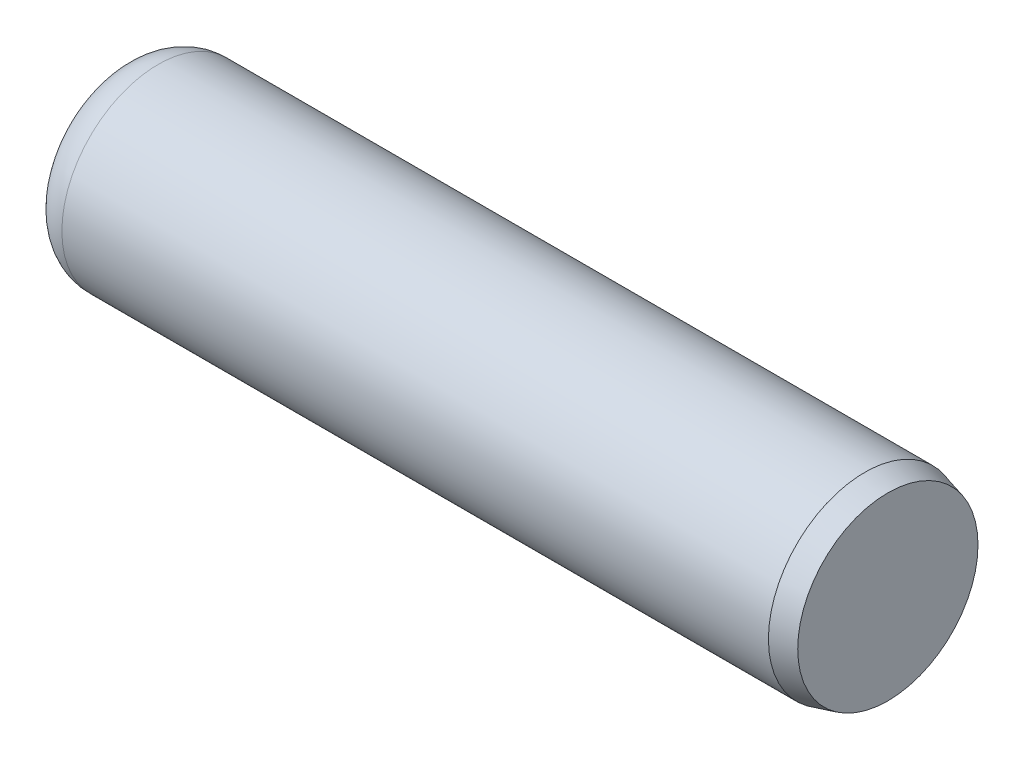
ISO-10303-21;
HEADER;
FILE_DESCRIPTION(('STEP AP214'),'2;1');
FILE_NAME('part.step','',(''),(''),'','','');
FILE_SCHEMA(('AUTOMOTIVE_DESIGN { 1 0 10303 214 1 1 1 1 }'));
ENDSEC;
DATA;
#1=APPLICATION_CONTEXT('core data for automotive mechanical design processes');
#2=APPLICATION_PROTOCOL_DEFINITION('international standard','automotive_design',2000,#1);
#3=PRODUCT_CONTEXT('',#1,'mechanical');
#4=PRODUCT('Part','Part','',(#3));
#5=PRODUCT_RELATED_PRODUCT_CATEGORY('part','',(#4));
#6=PRODUCT_DEFINITION_FORMATION('','',#4);
#7=PRODUCT_DEFINITION_CONTEXT('part definition',#1,'design');
#8=PRODUCT_DEFINITION('design','',#6,#7);
#9=PRODUCT_DEFINITION_SHAPE('','',#8);
#10=(LENGTH_UNIT() NAMED_UNIT(*) SI_UNIT(.MILLI.,.METRE.));
#11=(NAMED_UNIT(*) PLANE_ANGLE_UNIT() SI_UNIT($,.RADIAN.));
#12=(NAMED_UNIT(*) SI_UNIT($,.STERADIAN.) SOLID_ANGLE_UNIT());
#13=UNCERTAINTY_MEASURE_WITH_UNIT(LENGTH_MEASURE(1.E-05),#10,'distance_accuracy_value','');
#14=(GEOMETRIC_REPRESENTATION_CONTEXT(3) GLOBAL_UNCERTAINTY_ASSIGNED_CONTEXT((#13)) GLOBAL_UNIT_ASSIGNED_CONTEXT((#10,
#11,#12)) REPRESENTATION_CONTEXT('',''));
#15=CARTESIAN_POINT('',(0.,0.,0.));
#16=DIRECTION('',(0.,0.,1.));
#17=DIRECTION('',(1.,0.,0.));
#18=AXIS2_PLACEMENT_3D('',#15,#16,#17);
#19=CARTESIAN_POINT('',(0.,0.477773999999996,0.));
#20=DIRECTION('',(1.,0.,0.));
#21=DIRECTION('',(0.,0.,-1.));
#22=AXIS2_PLACEMENT_3D('',#19,#20,#21);
#23=PLANE('',#22);
#24=CARTESIAN_POINT('',(0.,0.,0.));
#25=DIRECTION('',(-1.,0.,0.));
#26=DIRECTION('',(0.,0.,1.));
#27=AXIS2_PLACEMENT_3D('',#24,#25,#26);
#28=CIRCLE('',#27,0.477773999999996);
#29=CARTESIAN_POINT('',(0.,0.,0.477773999999996));
#30=VERTEX_POINT('',#29);
#31=EDGE_CURVE('E44',#30,#30,#28,.T.);
#32=ORIENTED_EDGE('',*,*,#31,.T.);
#33=EDGE_LOOP('',(#32));
#34=FACE_BOUND('',#33,.T.);
#35=ADVANCED_FACE('F30',(#34),#23,.F.);
#36=CARTESIAN_POINT('',(6.35,0.,0.));
#37=DIRECTION('',(-1.,0.,0.));
#38=DIRECTION('',(0.,0.,1.));
#39=AXIS2_PLACEMENT_3D('',#36,#37,#38);
#40=PLANE('',#39);
#41=CARTESIAN_POINT('',(6.35,0.,0.));
#42=DIRECTION('',(-1.,0.,0.));
#43=DIRECTION('',(0.,0.,1.));
#44=AXIS2_PLACEMENT_3D('',#41,#42,#43);
#45=CIRCLE('',#44,0.745082337014162);
#46=CARTESIAN_POINT('',(6.35,0.,0.745082337014162));
#47=VERTEX_POINT('',#46);
#48=EDGE_CURVE('E10',#47,#47,#45,.T.);
#49=ORIENTED_EDGE('',*,*,#48,.F.);
#50=EDGE_LOOP('',(#49));
#51=FACE_BOUND('',#50,.T.);
#52=ADVANCED_FACE('F64',(#51),#40,.F.);
#53=CARTESIAN_POINT('',(6.35,0.,0.));
#54=DIRECTION('',(-1.,0.,0.));
#55=DIRECTION('',(0.,0.,1.));
#56=AXIS2_PLACEMENT_3D('',#53,#54,#55);
#57=CONICAL_SURFACE('',#56,0.745082337014162,0.26179938779915);
#58=CARTESIAN_POINT('',(6.1588904,0.,0.));
#59=DIRECTION('',(-1.,0.,0.));
#60=DIRECTION('',(0.,0.,1.));
#61=AXIS2_PLACEMENT_3D('',#58,#59,#60);
#62=CIRCLE('',#61,0.796289999999998);
#63=CARTESIAN_POINT('',(6.1588904,0.,0.796289999999998));
#64=VERTEX_POINT('',#63);
#65=EDGE_CURVE('E36',#64,#64,#62,.T.);
#66=ORIENTED_EDGE('',*,*,#65,.F.);
#67=EDGE_LOOP('',(#66));
#68=FACE_BOUND('',#67,.T.);
#69=ORIENTED_EDGE('',*,*,#48,.T.);
#70=EDGE_LOOP('',(#69));
#71=FACE_BOUND('',#70,.T.);
#72=ADVANCED_FACE('F59',(#68,#71),#57,.T.);
#73=CARTESIAN_POINT('',(-6.35,0.,0.));
#74=DIRECTION('',(-1.,0.,0.));
#75=DIRECTION('',(0.,0.,1.));
#76=AXIS2_PLACEMENT_3D('',#73,#74,#75);
#77=CYLINDRICAL_SURFACE('',#76,0.796289999999997);
#78=CARTESIAN_POINT('',(0.318516,0.,0.));
#79=DIRECTION('',(-1.,0.,0.));
#80=DIRECTION('',(0.,0.,1.));
#81=AXIS2_PLACEMENT_3D('',#78,#79,#80);
#82=CIRCLE('',#81,0.796289999999996);
#83=CARTESIAN_POINT('',(0.318516,0.,0.796289999999996));
#84=VERTEX_POINT('',#83);
#85=EDGE_CURVE('E40',#84,#84,#82,.T.);
#86=ORIENTED_EDGE('',*,*,#85,.F.);
#87=EDGE_LOOP('',(#86));
#88=FACE_BOUND('',#87,.T.);
#89=ORIENTED_EDGE('',*,*,#65,.T.);
#90=EDGE_LOOP('',(#89));
#91=FACE_BOUND('',#90,.T.);
#92=ADVANCED_FACE('F54',(#88,#91),#77,.T.);
#93=CARTESIAN_POINT('',(0.318516,0.,0.));
#94=DIRECTION('',(-1.,0.,0.));
#95=DIRECTION('',(0.,0.,1.));
#96=AXIS2_PLACEMENT_3D('',#93,#94,#95);
#97=TOROIDAL_SURFACE('',#96,0.477773999999996,0.318516);
#98=ORIENTED_EDGE('',*,*,#31,.F.);
#99=EDGE_LOOP('',(#98));
#100=FACE_BOUND('',#99,.T.);
#101=ORIENTED_EDGE('',*,*,#85,.T.);
#102=EDGE_LOOP('',(#101));
#103=FACE_BOUND('',#102,.T.);
#104=ADVANCED_FACE('F51',(#100,#103),#97,.T.);
#105=CLOSED_SHELL('',(#35,#52,#72,#92,#104));
#106=MANIFOLD_SOLID_BREP('B2',#105);
#107=ADVANCED_BREP_SHAPE_REPRESENTATION('',(#18,#106),#14);
#108=SHAPE_DEFINITION_REPRESENTATION(#9,#107);
ENDSEC;
END-ISO-10303-21;
